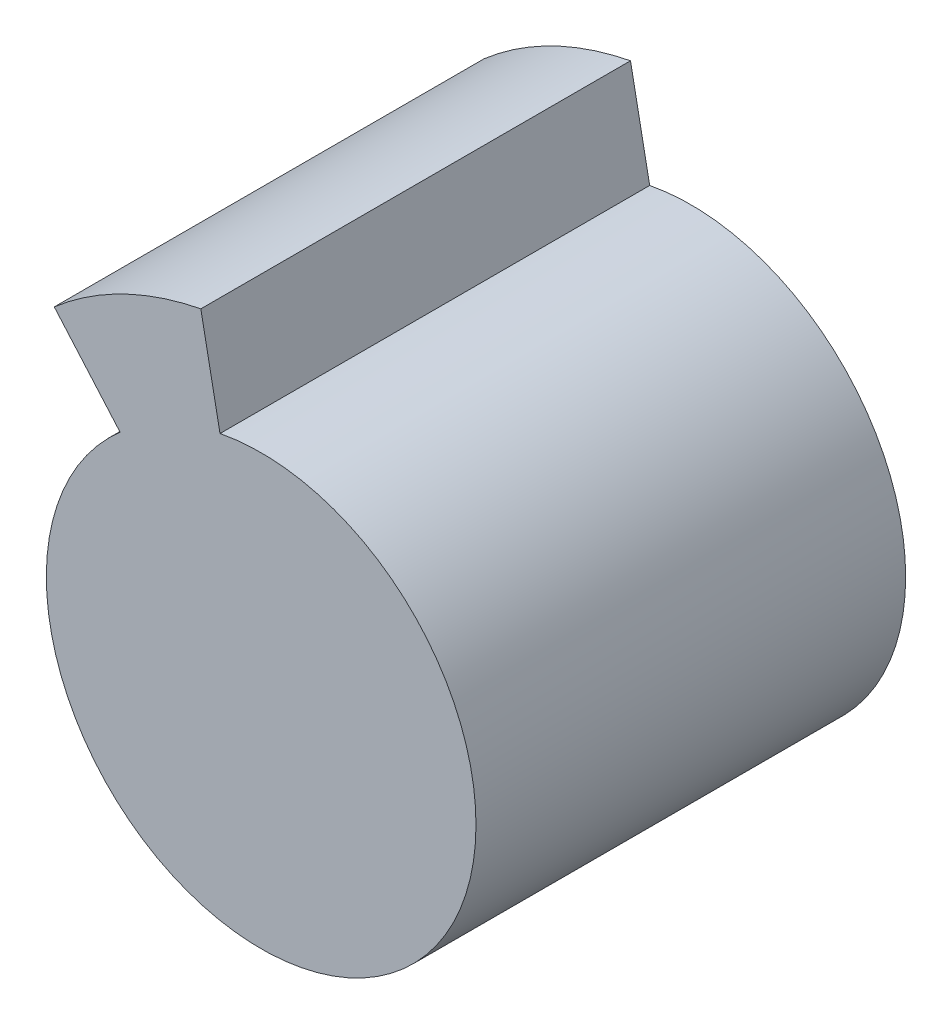
ISO-10303-21;
HEADER;
FILE_DESCRIPTION(('STEP AP214'),'2;1');
FILE_NAME('part.step','',(''),(''),'','','');
FILE_SCHEMA(('AUTOMOTIVE_DESIGN { 1 0 10303 214 1 1 1 1 }'));
ENDSEC;
DATA;
#1=APPLICATION_CONTEXT('core data for automotive mechanical design processes');
#2=APPLICATION_PROTOCOL_DEFINITION('international standard','automotive_design',2000,#1);
#3=PRODUCT_CONTEXT('',#1,'mechanical');
#4=PRODUCT('Part','Part','',(#3));
#5=PRODUCT_RELATED_PRODUCT_CATEGORY('part','',(#4));
#6=PRODUCT_DEFINITION_FORMATION('','',#4);
#7=PRODUCT_DEFINITION_CONTEXT('part definition',#1,'design');
#8=PRODUCT_DEFINITION('design','',#6,#7);
#9=PRODUCT_DEFINITION_SHAPE('','',#8);
#10=(LENGTH_UNIT() NAMED_UNIT(*) SI_UNIT(.MILLI.,.METRE.));
#11=(NAMED_UNIT(*) PLANE_ANGLE_UNIT() SI_UNIT($,.RADIAN.));
#12=(NAMED_UNIT(*) SI_UNIT($,.STERADIAN.) SOLID_ANGLE_UNIT());
#13=UNCERTAINTY_MEASURE_WITH_UNIT(LENGTH_MEASURE(1.E-05),#10,'distance_accuracy_value','');
#14=(GEOMETRIC_REPRESENTATION_CONTEXT(3) GLOBAL_UNCERTAINTY_ASSIGNED_CONTEXT((#13)) GLOBAL_UNIT_ASSIGNED_CONTEXT((#10,
#11,#12)) REPRESENTATION_CONTEXT('',''));
#15=CARTESIAN_POINT('',(0.,0.,0.));
#16=DIRECTION('',(0.,0.,1.));
#17=DIRECTION('',(1.,0.,0.));
#18=AXIS2_PLACEMENT_3D('',#15,#16,#17);
#19=CARTESIAN_POINT('',(-24.4538534200145,13.3695594399239,30.));
#20=DIRECTION('',(0.,0.,-1.));
#21=DIRECTION('',(-1.,0.,0.));
#22=AXIS2_PLACEMENT_3D('',#19,#20,#21);
#23=CYLINDRICAL_SURFACE('',#22,15.);
#24=CARTESIAN_POINT('',(-24.4538534200145,13.3695594399239,0.));
#25=DIRECTION('',(0.,0.,1.));
#26=DIRECTION('',(1.,0.,0.));
#27=AXIS2_PLACEMENT_3D('',#24,#25,#26);
#28=CIRCLE('',#27,15.);
#29=CARTESIAN_POINT('',(-34.3025781813256,24.6833837525044,0.));
#30=VERTEX_POINT('',#29);
#31=CARTESIAN_POINT('',(-27.3261871019004,28.0919810892282,0.));
#32=VERTEX_POINT('',#31);
#33=EDGE_CURVE('E118',#30,#32,#28,.T.);
#34=ORIENTED_EDGE('',*,*,#33,.T.);
#35=DIRECTION('',(0.,0.,-1.));
#36=VECTOR('',#35,1.);
#37=CARTESIAN_POINT('',(-27.3261871019004,28.0919810892282,30.));
#38=LINE('',#37,#36);
#39=CARTESIAN_POINT('',(-27.3261871019004,28.0919810892282,30.));
#40=VERTEX_POINT('',#39);
#41=EDGE_CURVE('E12',#40,#32,#38,.T.);
#42=ORIENTED_EDGE('',*,*,#41,.F.);
#43=CARTESIAN_POINT('',(-24.4538534200145,13.3695594399239,30.));
#44=DIRECTION('',(0.,0.,1.));
#45=DIRECTION('',(1.,0.,0.));
#46=AXIS2_PLACEMENT_3D('',#43,#44,#45);
#47=CIRCLE('',#46,15.);
#48=CARTESIAN_POINT('',(-34.3025781813256,24.6833837525044,30.));
#49=VERTEX_POINT('',#48);
#50=EDGE_CURVE('E100',#49,#40,#47,.T.);
#51=ORIENTED_EDGE('',*,*,#50,.F.);
#52=DIRECTION('',(0.,0.,-1.));
#53=VECTOR('',#52,1.);
#54=CARTESIAN_POINT('',(-34.3025781813256,24.6833837525044,30.));
#55=LINE('',#54,#53);
#56=EDGE_CURVE('E67',#49,#30,#55,.T.);
#57=ORIENTED_EDGE('',*,*,#56,.T.);
#58=EDGE_LOOP('',(#34,#42,#51,#57));
#59=FACE_BOUND('',#58,.T.);
#60=ADVANCED_FACE('F50',(#59),#23,.T.);
#61=CARTESIAN_POINT('',(-21.0444326820315,-4.10575340447725,30.));
#62=DIRECTION('',(-0.981494776620286,-0.19148891212573,0.));
#63=DIRECTION('',(0.19148891212573,-0.981494776620286,0.));
#64=AXIS2_PLACEMENT_3D('',#61,#62,#63);
#65=PLANE('',#64);
#66=DIRECTION('',(-0.19148891212573,0.981494776620286,0.));
#67=VECTOR('',#66,1.);
#68=CARTESIAN_POINT('',(-21.0444326820315,-4.10575340447725,0.));
#69=LINE('',#68,#67);
#70=CARTESIAN_POINT('',(-28.6666094867805,34.9624445255702,0.));
#71=VERTEX_POINT('',#70);
#72=EDGE_CURVE('E106',#32,#71,#69,.T.);
#73=ORIENTED_EDGE('',*,*,#72,.T.);
#74=DIRECTION('',(0.,0.,-1.));
#75=VECTOR('',#74,1.);
#76=CARTESIAN_POINT('',(-28.6666094867805,34.9624445255702,30.));
#77=LINE('',#76,#75);
#78=CARTESIAN_POINT('',(-28.6666094867805,34.9624445255702,30.));
#79=VERTEX_POINT('',#78);
#80=EDGE_CURVE('E59',#79,#71,#77,.T.);
#81=ORIENTED_EDGE('',*,*,#80,.F.);
#82=DIRECTION('',(-0.19148891212573,0.981494776620286,0.));
#83=VECTOR('',#82,1.);
#84=CARTESIAN_POINT('',(-21.0444326820315,-4.10575340447725,30.));
#85=LINE('',#84,#83);
#86=EDGE_CURVE('E93',#40,#79,#85,.T.);
#87=ORIENTED_EDGE('',*,*,#86,.F.);
#88=ORIENTED_EDGE('',*,*,#41,.T.);
#89=EDGE_LOOP('',(#73,#81,#87,#88));
#90=FACE_BOUND('',#89,.T.);
#91=ADVANCED_FACE('F105',(#90),#65,.F.);
#92=CARTESIAN_POINT('',(-24.4538534200145,13.3695594399239,30.));
#93=DIRECTION('',(0.,0.,-1.));
#94=DIRECTION('',(-1.,0.,0.));
#95=AXIS2_PLACEMENT_3D('',#92,#93,#94);
#96=CYLINDRICAL_SURFACE('',#95,22.);
#97=CARTESIAN_POINT('',(-24.4538534200145,13.3695594399239,0.));
#98=DIRECTION('',(0.,0.,1.));
#99=DIRECTION('',(1.,0.,0.));
#100=AXIS2_PLACEMENT_3D('',#97,#98,#99);
#101=CIRCLE('',#100,22.);
#102=CARTESIAN_POINT('',(-38.8986497366041,29.9631684317086,0.));
#103=VERTEX_POINT('',#102);
#104=EDGE_CURVE('E133',#71,#103,#101,.T.);
#105=ORIENTED_EDGE('',*,*,#104,.T.);
#106=DIRECTION('',(0.,0.,-1.));
#107=VECTOR('',#106,1.);
#108=CARTESIAN_POINT('',(-38.8986497366041,29.9631684317086,30.));
#109=LINE('',#108,#107);
#110=CARTESIAN_POINT('',(-38.8986497366041,29.9631684317086,30.));
#111=VERTEX_POINT('',#110);
#112=EDGE_CURVE('E82',#111,#103,#109,.T.);
#113=ORIENTED_EDGE('',*,*,#112,.F.);
#114=CARTESIAN_POINT('',(-24.4538534200145,13.3695594399239,30.));
#115=DIRECTION('',(0.,0.,1.));
#116=DIRECTION('',(1.,0.,0.));
#117=AXIS2_PLACEMENT_3D('',#114,#115,#116);
#118=CIRCLE('',#117,22.);
#119=EDGE_CURVE('E99',#79,#111,#118,.T.);
#120=ORIENTED_EDGE('',*,*,#119,.F.);
#121=ORIENTED_EDGE('',*,*,#80,.T.);
#122=EDGE_LOOP('',(#105,#113,#120,#121));
#123=FACE_BOUND('',#122,.T.);
#124=ADVANCED_FACE('F110',(#123),#96,.T.);
#125=CARTESIAN_POINT('',(-7.29080388987751,-6.34667101205164,30.));
#126=DIRECTION('',(-0.754254954172034,-0.656581650754072,0.));
#127=DIRECTION('',(0.656581650754072,-0.754254954172034,0.));
#128=AXIS2_PLACEMENT_3D('',#125,#126,#127);
#129=PLANE('',#128);
#130=DIRECTION('',(-0.656581650754072,0.754254954172034,0.));
#131=VECTOR('',#130,1.);
#132=CARTESIAN_POINT('',(-7.29080388987751,-6.34667101205164,0.));
#133=LINE('',#132,#131);
#134=EDGE_CURVE('E130',#30,#103,#133,.T.);
#135=ORIENTED_EDGE('',*,*,#134,.F.);
#136=ORIENTED_EDGE('',*,*,#56,.F.);
#137=DIRECTION('',(-0.656581650754072,0.754254954172034,0.));
#138=VECTOR('',#137,1.);
#139=CARTESIAN_POINT('',(-7.29080388987751,-6.34667101205164,30.));
#140=LINE('',#139,#138);
#141=EDGE_CURVE('E112',#49,#111,#140,.T.);
#142=ORIENTED_EDGE('',*,*,#141,.T.);
#143=ORIENTED_EDGE('',*,*,#112,.T.);
#144=EDGE_LOOP('',(#135,#136,#142,#143));
#145=FACE_BOUND('',#144,.T.);
#146=ADVANCED_FACE('F138',(#145),#129,.T.);
#147=CARTESIAN_POINT('',(0.,0.,30.));
#148=DIRECTION('',(0.,0.,1.));
#149=DIRECTION('',(1.,0.,0.));
#150=AXIS2_PLACEMENT_3D('',#147,#148,#149);
#151=PLANE('',#150);
#152=ORIENTED_EDGE('',*,*,#50,.T.);
#153=ORIENTED_EDGE('',*,*,#86,.T.);
#154=ORIENTED_EDGE('',*,*,#119,.T.);
#155=ORIENTED_EDGE('',*,*,#141,.F.);
#156=EDGE_LOOP('',(#152,#153,#154,#155));
#157=FACE_BOUND('',#156,.T.);
#158=ADVANCED_FACE('F96',(#157),#151,.T.);
#159=CARTESIAN_POINT('',(0.,0.,0.));
#160=DIRECTION('',(0.,0.,1.));
#161=DIRECTION('',(1.,0.,0.));
#162=AXIS2_PLACEMENT_3D('',#159,#160,#161);
#163=PLANE('',#162);
#164=ORIENTED_EDGE('',*,*,#33,.F.);
#165=ORIENTED_EDGE('',*,*,#134,.T.);
#166=ORIENTED_EDGE('',*,*,#104,.F.);
#167=ORIENTED_EDGE('',*,*,#72,.F.);
#168=EDGE_LOOP('',(#164,#165,#166,#167));
#169=FACE_BOUND('',#168,.T.);
#170=ADVANCED_FACE('F137',(#169),#163,.F.);
#171=CLOSED_SHELL('',(#60,#91,#124,#146,#158,#170));
#172=MANIFOLD_SOLID_BREP('B2',#171);
#173=ADVANCED_BREP_SHAPE_REPRESENTATION('',(#18,#172),#14);
#174=SHAPE_DEFINITION_REPRESENTATION(#9,#173);
ENDSEC;
END-ISO-10303-21;
